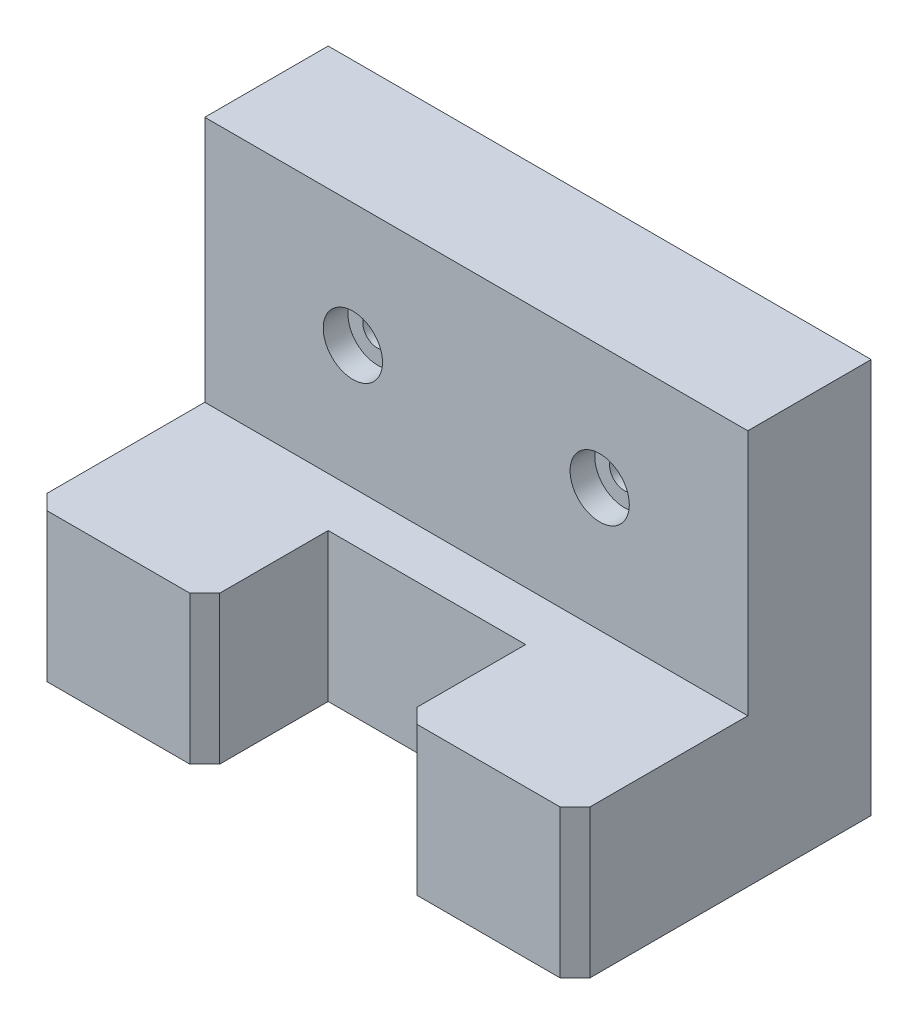
ISO-10303-21;
HEADER;
FILE_DESCRIPTION(('STEP AP214'),'2;1');
FILE_NAME('part.step','',(''),(''),'','','');
FILE_SCHEMA(('AUTOMOTIVE_DESIGN { 1 0 10303 214 1 1 1 1 }'));
ENDSEC;
DATA;
#1=APPLICATION_CONTEXT('core data for automotive mechanical design processes');
#2=APPLICATION_PROTOCOL_DEFINITION('international standard','automotive_design',2000,#1);
#3=PRODUCT_CONTEXT('',#1,'mechanical');
#4=PRODUCT('Part','Part','',(#3));
#5=PRODUCT_RELATED_PRODUCT_CATEGORY('part','',(#4));
#6=PRODUCT_DEFINITION_FORMATION('','',#4);
#7=PRODUCT_DEFINITION_CONTEXT('part definition',#1,'design');
#8=PRODUCT_DEFINITION('design','',#6,#7);
#9=PRODUCT_DEFINITION_SHAPE('','',#8);
#10=(LENGTH_UNIT() NAMED_UNIT(*) SI_UNIT(.MILLI.,.METRE.));
#11=(NAMED_UNIT(*) PLANE_ANGLE_UNIT() SI_UNIT($,.RADIAN.));
#12=(NAMED_UNIT(*) SI_UNIT($,.STERADIAN.) SOLID_ANGLE_UNIT());
#13=UNCERTAINTY_MEASURE_WITH_UNIT(LENGTH_MEASURE(1.E-05),#10,'distance_accuracy_value','');
#14=(GEOMETRIC_REPRESENTATION_CONTEXT(3) GLOBAL_UNCERTAINTY_ASSIGNED_CONTEXT((#13)) GLOBAL_UNIT_ASSIGNED_CONTEXT((#10,
#11,#12)) REPRESENTATION_CONTEXT('',''));
#15=CARTESIAN_POINT('',(0.,0.,0.));
#16=DIRECTION('',(0.,0.,1.));
#17=DIRECTION('',(1.,0.,0.));
#18=AXIS2_PLACEMENT_3D('',#15,#16,#17);
#19=CARTESIAN_POINT('',(25.,55.,-36.8755908022283));
#20=DIRECTION('',(0.,0.,1.));
#21=DIRECTION('',(1.,0.,0.));
#22=AXIS2_PLACEMENT_3D('',#19,#20,#21);
#23=CYLINDRICAL_SURFACE('',#22,3.);
#24=CARTESIAN_POINT('',(25.,55.,-36.8755908022283));
#25=DIRECTION('',(0.,0.,1.));
#26=DIRECTION('',(1.,0.,0.));
#27=AXIS2_PLACEMENT_3D('',#24,#25,#26);
#28=CIRCLE('',#27,3.);
#29=CARTESIAN_POINT('',(28.,55.,-36.8755908022283));
#30=VERTEX_POINT('',#29);
#31=EDGE_CURVE('E231',#30,#30,#28,.T.);
#32=ORIENTED_EDGE('',*,*,#31,.F.);
#33=EDGE_LOOP('',(#32));
#34=FACE_BOUND('',#33,.T.);
#35=CARTESIAN_POINT('',(25.,55.,-16.8755908022283));
#36=DIRECTION('',(0.,0.,1.));
#37=DIRECTION('',(1.,0.,0.));
#38=AXIS2_PLACEMENT_3D('',#35,#36,#37);
#39=CIRCLE('',#38,3.);
#40=CARTESIAN_POINT('',(28.,55.,-16.8755908022283));
#41=VERTEX_POINT('',#40);
#42=EDGE_CURVE('E227',#41,#41,#39,.F.);
#43=ORIENTED_EDGE('',*,*,#42,.F.);
#44=EDGE_LOOP('',(#43));
#45=FACE_BOUND('',#44,.T.);
#46=ADVANCED_FACE('F45',(#34,#45),#23,.F.);
#47=CARTESIAN_POINT('',(-25.,55.,-36.8755908022283));
#48=DIRECTION('',(0.,0.,1.));
#49=DIRECTION('',(1.,0.,0.));
#50=AXIS2_PLACEMENT_3D('',#47,#48,#49);
#51=CYLINDRICAL_SURFACE('',#50,3.);
#52=CARTESIAN_POINT('',(-25.,55.,-36.8755908022283));
#53=DIRECTION('',(0.,0.,1.));
#54=DIRECTION('',(1.,0.,0.));
#55=AXIS2_PLACEMENT_3D('',#52,#53,#54);
#56=CIRCLE('',#55,3.);
#57=CARTESIAN_POINT('',(-22.,55.,-36.8755908022283));
#58=VERTEX_POINT('',#57);
#59=EDGE_CURVE('E178',#58,#58,#56,.T.);
#60=ORIENTED_EDGE('',*,*,#59,.F.);
#61=EDGE_LOOP('',(#60));
#62=FACE_BOUND('',#61,.T.);
#63=CARTESIAN_POINT('',(-25.,55.,-16.8755908022283));
#64=DIRECTION('',(0.,0.,1.));
#65=DIRECTION('',(1.,0.,0.));
#66=AXIS2_PLACEMENT_3D('',#63,#64,#65);
#67=CIRCLE('',#66,3.);
#68=CARTESIAN_POINT('',(-22.,55.,-16.8755908022283));
#69=VERTEX_POINT('',#68);
#70=EDGE_CURVE('E224',#69,#69,#67,.F.);
#71=ORIENTED_EDGE('',*,*,#70,.F.);
#72=EDGE_LOOP('',(#71));
#73=FACE_BOUND('',#72,.T.);
#74=ADVANCED_FACE('F315',(#62,#73),#51,.F.);
#75=CARTESIAN_POINT('',(55.,30.,23.1244091977717));
#76=DIRECTION('',(0.,0.,-1.));
#77=DIRECTION('',(-1.,0.,0.));
#78=AXIS2_PLACEMENT_3D('',#75,#76,#77);
#79=PLANE('',#78);
#80=DIRECTION('',(-1.,0.,0.));
#81=VECTOR('',#80,1.);
#82=CARTESIAN_POINT('',(55.,0.,23.1244091977717));
#83=LINE('',#82,#81);
#84=CARTESIAN_POINT('',(-23.,0.,23.1244091977717));
#85=VERTEX_POINT('',#84);
#86=CARTESIAN_POINT('',(-52.,0.,23.1244091977717));
#87=VERTEX_POINT('',#86);
#88=EDGE_CURVE('E220',#85,#87,#83,.T.);
#89=ORIENTED_EDGE('',*,*,#88,.F.);
#90=DIRECTION('',(0.,1.,0.));
#91=VECTOR('',#90,1.);
#92=CARTESIAN_POINT('',(-23.,30.,23.1244091977717));
#93=LINE('',#92,#91);
#94=CARTESIAN_POINT('',(-23.,30.,23.1244091977717));
#95=VERTEX_POINT('',#94);
#96=EDGE_CURVE('E257',#85,#95,#93,.T.);
#97=ORIENTED_EDGE('',*,*,#96,.T.);
#98=DIRECTION('',(-1.,0.,0.));
#99=VECTOR('',#98,1.);
#100=CARTESIAN_POINT('',(55.,30.,23.1244091977717));
#101=LINE('',#100,#99);
#102=CARTESIAN_POINT('',(-52.,30.,23.1244091977717));
#103=VERTEX_POINT('',#102);
#104=EDGE_CURVE('E196',#95,#103,#101,.T.);
#105=ORIENTED_EDGE('',*,*,#104,.T.);
#106=DIRECTION('',(0.,-1.,0.));
#107=VECTOR('',#106,1.);
#108=CARTESIAN_POINT('',(-52.,30.,23.1244091977717));
#109=LINE('',#108,#107);
#110=EDGE_CURVE('E254',#103,#87,#109,.T.);
#111=ORIENTED_EDGE('',*,*,#110,.T.);
#112=EDGE_LOOP('',(#89,#97,#105,#111));
#113=FACE_BOUND('',#112,.T.);
#114=ADVANCED_FACE('F271',(#113),#79,.F.);
#115=CARTESIAN_POINT('',(52.,0.,23.1244091977717));
#116=VERTEX_POINT('',#115);
#117=CARTESIAN_POINT('',(23.,0.,23.1244091977717));
#118=VERTEX_POINT('',#117);
#119=EDGE_CURVE('E221',#116,#118,#83,.T.);
#120=ORIENTED_EDGE('',*,*,#119,.F.);
#121=DIRECTION('',(0.,1.,0.));
#122=VECTOR('',#121,1.);
#123=CARTESIAN_POINT('',(52.,30.,23.1244091977717));
#124=LINE('',#123,#122);
#125=CARTESIAN_POINT('',(52.,30.,23.1244091977717));
#126=VERTEX_POINT('',#125);
#127=EDGE_CURVE('E243',#116,#126,#124,.T.);
#128=ORIENTED_EDGE('',*,*,#127,.T.);
#129=CARTESIAN_POINT('',(23.,30.,23.1244091977717));
#130=VERTEX_POINT('',#129);
#131=EDGE_CURVE('E207',#126,#130,#101,.T.);
#132=ORIENTED_EDGE('',*,*,#131,.T.);
#133=DIRECTION('',(0.,-1.,0.));
#134=VECTOR('',#133,1.);
#135=CARTESIAN_POINT('',(23.,30.,23.1244091977717));
#136=LINE('',#135,#134);
#137=EDGE_CURVE('E241',#130,#118,#136,.T.);
#138=ORIENTED_EDGE('',*,*,#137,.T.);
#139=EDGE_LOOP('',(#120,#128,#132,#138));
#140=FACE_BOUND('',#139,.T.);
#141=ADVANCED_FACE('F300',(#140),#79,.F.);
#142=CARTESIAN_POINT('',(55.,0.,23.1244091977717));
#143=DIRECTION('',(0.,1.,0.));
#144=DIRECTION('',(0.,0.,1.));
#145=AXIS2_PLACEMENT_3D('',#142,#143,#144);
#146=PLANE('',#145);
#147=DIRECTION('',(0.,0.,-1.));
#148=VECTOR('',#147,1.);
#149=CARTESIAN_POINT('',(55.,0.,23.1244091977717));
#150=LINE('',#149,#148);
#151=CARTESIAN_POINT('',(55.,0.,20.1244091977718));
#152=VERTEX_POINT('',#151);
#153=CARTESIAN_POINT('',(55.,0.,-36.8755908022283));
#154=VERTEX_POINT('',#153);
#155=EDGE_CURVE('E184',#152,#154,#150,.T.);
#156=ORIENTED_EDGE('',*,*,#155,.F.);
#157=DIRECTION('',(-0.707106781186549,0.,0.707106781186546));
#158=VECTOR('',#157,1.);
#159=CARTESIAN_POINT('',(55.,0.,20.1244091977718));
#160=LINE('',#159,#158);
#161=EDGE_CURVE('E239',#152,#116,#160,.T.);
#162=ORIENTED_EDGE('',*,*,#161,.T.);
#163=ORIENTED_EDGE('',*,*,#119,.T.);
#164=DIRECTION('',(0.707106781186548,0.,0.707106781186548));
#165=VECTOR('',#164,1.);
#166=CARTESIAN_POINT('',(20.,0.,20.1244091977717));
#167=LINE('',#166,#165);
#168=CARTESIAN_POINT('',(20.,0.,20.1244091977717));
#169=VERTEX_POINT('',#168);
#170=EDGE_CURVE('E156',#118,#169,#167,.F.);
#171=ORIENTED_EDGE('',*,*,#170,.T.);
#172=DIRECTION('',(0.,0.,-1.));
#173=VECTOR('',#172,1.);
#174=CARTESIAN_POINT('',(20.,0.,23.1244091977717));
#175=LINE('',#174,#173);
#176=CARTESIAN_POINT('',(20.,0.,-1.87559080222826));
#177=VERTEX_POINT('',#176);
#178=EDGE_CURVE('E147',#169,#177,#175,.T.);
#179=ORIENTED_EDGE('',*,*,#178,.T.);
#180=DIRECTION('',(-1.,0.,0.));
#181=VECTOR('',#180,1.);
#182=CARTESIAN_POINT('',(-20.,0.,-1.87559080222826));
#183=LINE('',#182,#181);
#184=CARTESIAN_POINT('',(-20.,0.,-1.87559080222826));
#185=VERTEX_POINT('',#184);
#186=EDGE_CURVE('E153',#177,#185,#183,.T.);
#187=ORIENTED_EDGE('',*,*,#186,.T.);
#188=DIRECTION('',(0.,0.,1.));
#189=VECTOR('',#188,1.);
#190=CARTESIAN_POINT('',(-20.,0.,23.1244091977717));
#191=LINE('',#190,#189);
#192=CARTESIAN_POINT('',(-20.,0.,20.1244091977717));
#193=VERTEX_POINT('',#192);
#194=EDGE_CURVE('E158',#185,#193,#191,.T.);
#195=ORIENTED_EDGE('',*,*,#194,.T.);
#196=DIRECTION('',(0.707106781186546,0.,-0.707106781186549));
#197=VECTOR('',#196,1.);
#198=CARTESIAN_POINT('',(-23.,0.,23.1244091977717));
#199=LINE('',#198,#197);
#200=EDGE_CURVE('E236',#193,#85,#199,.F.);
#201=ORIENTED_EDGE('',*,*,#200,.T.);
#202=ORIENTED_EDGE('',*,*,#88,.T.);
#203=DIRECTION('',(0.707106781186546,0.,0.707106781186549));
#204=VECTOR('',#203,1.);
#205=CARTESIAN_POINT('',(-52.,0.,23.1244091977717));
#206=LINE('',#205,#204);
#207=CARTESIAN_POINT('',(-55.,0.,20.1244091977717));
#208=VERTEX_POINT('',#207);
#209=EDGE_CURVE('E234',#87,#208,#206,.F.);
#210=ORIENTED_EDGE('',*,*,#209,.T.);
#211=DIRECTION('',(0.,0.,-1.));
#212=VECTOR('',#211,1.);
#213=CARTESIAN_POINT('',(-55.,0.,23.1244091977717));
#214=LINE('',#213,#212);
#215=CARTESIAN_POINT('',(-55.,0.,-36.8755908022283));
#216=VERTEX_POINT('',#215);
#217=EDGE_CURVE('E182',#208,#216,#214,.T.);
#218=ORIENTED_EDGE('',*,*,#217,.T.);
#219=DIRECTION('',(-1.,0.,0.));
#220=VECTOR('',#219,1.);
#221=CARTESIAN_POINT('',(55.,0.,-36.8755908022283));
#222=LINE('',#221,#220);
#223=EDGE_CURVE('E217',#154,#216,#222,.T.);
#224=ORIENTED_EDGE('',*,*,#223,.F.);
#225=EDGE_LOOP('',(#156,#162,#163,#171,#179,#187,#195,#201,#202,#210,#218,#224));
#226=FACE_BOUND('',#225,.T.);
#227=ADVANCED_FACE('F150',(#226),#146,.F.);
#228=CARTESIAN_POINT('',(55.,0.,-36.8755908022283));
#229=DIRECTION('',(0.,0.,1.));
#230=DIRECTION('',(1.,0.,0.));
#231=AXIS2_PLACEMENT_3D('',#228,#229,#230);
#232=PLANE('',#231);
#233=ORIENTED_EDGE('',*,*,#59,.T.);
#234=EDGE_LOOP('',(#233));
#235=FACE_BOUND('',#234,.T.);
#236=ORIENTED_EDGE('',*,*,#31,.T.);
#237=EDGE_LOOP('',(#236));
#238=FACE_BOUND('',#237,.T.);
#239=DIRECTION('',(0.,1.,0.));
#240=VECTOR('',#239,1.);
#241=CARTESIAN_POINT('',(-55.,0.,-36.8755908022283));
#242=LINE('',#241,#240);
#243=CARTESIAN_POINT('',(-55.,80.,-36.8755908022283));
#244=VERTEX_POINT('',#243);
#245=EDGE_CURVE('E198',#216,#244,#242,.T.);
#246=ORIENTED_EDGE('',*,*,#245,.T.);
#247=DIRECTION('',(-1.,0.,0.));
#248=VECTOR('',#247,1.);
#249=CARTESIAN_POINT('',(55.,80.,-36.8755908022283));
#250=LINE('',#249,#248);
#251=CARTESIAN_POINT('',(55.,80.,-36.8755908022283));
#252=VERTEX_POINT('',#251);
#253=EDGE_CURVE('E214',#252,#244,#250,.T.);
#254=ORIENTED_EDGE('',*,*,#253,.F.);
#255=DIRECTION('',(0.,1.,0.));
#256=VECTOR('',#255,1.);
#257=CARTESIAN_POINT('',(55.,0.,-36.8755908022283));
#258=LINE('',#257,#256);
#259=EDGE_CURVE('E186',#154,#252,#258,.T.);
#260=ORIENTED_EDGE('',*,*,#259,.F.);
#261=ORIENTED_EDGE('',*,*,#223,.T.);
#262=EDGE_LOOP('',(#246,#254,#260,#261));
#263=FACE_BOUND('',#262,.T.);
#264=ADVANCED_FACE('F285',(#235,#238,#263),#232,.F.);
#265=CARTESIAN_POINT('',(55.,80.,-36.8755908022283));
#266=DIRECTION('',(0.,-1.,0.));
#267=DIRECTION('',(0.,0.,-1.));
#268=AXIS2_PLACEMENT_3D('',#265,#266,#267);
#269=PLANE('',#268);
#270=DIRECTION('',(0.,0.,1.));
#271=VECTOR('',#270,1.);
#272=CARTESIAN_POINT('',(-55.,80.,-36.8755908022283));
#273=LINE('',#272,#271);
#274=CARTESIAN_POINT('',(-55.,80.,-11.8755908022283));
#275=VERTEX_POINT('',#274);
#276=EDGE_CURVE('E200',#244,#275,#273,.T.);
#277=ORIENTED_EDGE('',*,*,#276,.T.);
#278=DIRECTION('',(-1.,0.,0.));
#279=VECTOR('',#278,1.);
#280=CARTESIAN_POINT('',(55.,80.,-11.8755908022283));
#281=LINE('',#280,#279);
#282=CARTESIAN_POINT('',(55.,80.,-11.8755908022283));
#283=VERTEX_POINT('',#282);
#284=EDGE_CURVE('E211',#283,#275,#281,.T.);
#285=ORIENTED_EDGE('',*,*,#284,.F.);
#286=DIRECTION('',(0.,0.,1.));
#287=VECTOR('',#286,1.);
#288=CARTESIAN_POINT('',(55.,80.,-36.8755908022283));
#289=LINE('',#288,#287);
#290=EDGE_CURVE('E189',#252,#283,#289,.T.);
#291=ORIENTED_EDGE('',*,*,#290,.F.);
#292=ORIENTED_EDGE('',*,*,#253,.T.);
#293=EDGE_LOOP('',(#277,#285,#291,#292));
#294=FACE_BOUND('',#293,.T.);
#295=ADVANCED_FACE('F289',(#294),#269,.F.);
#296=CARTESIAN_POINT('',(55.,80.,-11.8755908022283));
#297=DIRECTION('',(0.,0.,-1.));
#298=DIRECTION('',(0.,1.,0.));
#299=AXIS2_PLACEMENT_3D('',#296,#297,#298);
#300=PLANE('',#299);
#301=CARTESIAN_POINT('',(-25.,55.,-11.8755908022283));
#302=DIRECTION('',(0.,0.,1.));
#303=DIRECTION('',(1.,0.,0.));
#304=AXIS2_PLACEMENT_3D('',#301,#302,#303);
#305=CIRCLE('',#304,6.);
#306=CARTESIAN_POINT('',(-19.,55.,-11.8755908022283));
#307=VERTEX_POINT('',#306);
#308=EDGE_CURVE('E502',#307,#307,#305,.T.);
#309=ORIENTED_EDGE('',*,*,#308,.F.);
#310=EDGE_LOOP('',(#309));
#311=FACE_BOUND('',#310,.T.);
#312=CARTESIAN_POINT('',(25.,55.,-11.8755908022283));
#313=DIRECTION('',(0.,0.,1.));
#314=DIRECTION('',(1.,0.,0.));
#315=AXIS2_PLACEMENT_3D('',#312,#313,#314);
#316=CIRCLE('',#315,6.);
#317=CARTESIAN_POINT('',(31.,55.,-11.8755908022283));
#318=VERTEX_POINT('',#317);
#319=EDGE_CURVE('E499',#318,#318,#316,.T.);
#320=ORIENTED_EDGE('',*,*,#319,.F.);
#321=EDGE_LOOP('',(#320));
#322=FACE_BOUND('',#321,.T.);
#323=DIRECTION('',(0.,-1.,0.));
#324=VECTOR('',#323,1.);
#325=CARTESIAN_POINT('',(-55.,80.,-11.8755908022283));
#326=LINE('',#325,#324);
#327=CARTESIAN_POINT('',(-55.,30.,-11.8755908022283));
#328=VERTEX_POINT('',#327);
#329=EDGE_CURVE('E202',#275,#328,#326,.T.);
#330=ORIENTED_EDGE('',*,*,#329,.T.);
#331=DIRECTION('',(-1.,0.,0.));
#332=VECTOR('',#331,1.);
#333=CARTESIAN_POINT('',(55.,30.,-11.8755908022283));
#334=LINE('',#333,#332);
#335=CARTESIAN_POINT('',(55.,30.,-11.8755908022283));
#336=VERTEX_POINT('',#335);
#337=EDGE_CURVE('E208',#336,#328,#334,.T.);
#338=ORIENTED_EDGE('',*,*,#337,.F.);
#339=DIRECTION('',(0.,-1.,0.));
#340=VECTOR('',#339,1.);
#341=CARTESIAN_POINT('',(55.,80.,-11.8755908022283));
#342=LINE('',#341,#340);
#343=EDGE_CURVE('E191',#283,#336,#342,.T.);
#344=ORIENTED_EDGE('',*,*,#343,.F.);
#345=ORIENTED_EDGE('',*,*,#284,.T.);
#346=EDGE_LOOP('',(#330,#338,#344,#345));
#347=FACE_BOUND('',#346,.T.);
#348=ADVANCED_FACE('F340',(#311,#322,#347),#300,.F.);
#349=CARTESIAN_POINT('',(55.,30.,-11.8755908022283));
#350=DIRECTION('',(0.,-1.,0.));
#351=DIRECTION('',(0.,0.,-1.));
#352=AXIS2_PLACEMENT_3D('',#349,#350,#351);
#353=PLANE('',#352);
#354=ORIENTED_EDGE('',*,*,#131,.F.);
#355=DIRECTION('',(0.707106781186549,0.,-0.707106781186546));
#356=VECTOR('',#355,1.);
#357=CARTESIAN_POINT('',(55.,30.,20.1244091977718));
#358=LINE('',#357,#356);
#359=CARTESIAN_POINT('',(55.,30.,20.1244091977718));
#360=VERTEX_POINT('',#359);
#361=EDGE_CURVE('E250',#126,#360,#358,.T.);
#362=ORIENTED_EDGE('',*,*,#361,.T.);
#363=DIRECTION('',(0.,0.,1.));
#364=VECTOR('',#363,1.);
#365=CARTESIAN_POINT('',(55.,30.,-11.8755908022283));
#366=LINE('',#365,#364);
#367=EDGE_CURVE('E193',#336,#360,#366,.T.);
#368=ORIENTED_EDGE('',*,*,#367,.F.);
#369=ORIENTED_EDGE('',*,*,#337,.T.);
#370=DIRECTION('',(0.,0.,1.));
#371=VECTOR('',#370,1.);
#372=CARTESIAN_POINT('',(-55.,30.,-11.8755908022283));
#373=LINE('',#372,#371);
#374=CARTESIAN_POINT('',(-55.,30.,20.1244091977717));
#375=VERTEX_POINT('',#374);
#376=EDGE_CURVE('E187',#328,#375,#373,.T.);
#377=ORIENTED_EDGE('',*,*,#376,.T.);
#378=DIRECTION('',(-0.707106781186546,0.,-0.707106781186549));
#379=VECTOR('',#378,1.);
#380=CARTESIAN_POINT('',(-52.,30.,23.1244091977717));
#381=LINE('',#380,#379);
#382=EDGE_CURVE('E245',#375,#103,#381,.F.);
#383=ORIENTED_EDGE('',*,*,#382,.T.);
#384=ORIENTED_EDGE('',*,*,#104,.F.);
#385=DIRECTION('',(-0.707106781186546,0.,0.707106781186549));
#386=VECTOR('',#385,1.);
#387=CARTESIAN_POINT('',(-23.,30.,23.1244091977717));
#388=LINE('',#387,#386);
#389=CARTESIAN_POINT('',(-20.,30.,20.1244091977717));
#390=VERTEX_POINT('',#389);
#391=EDGE_CURVE('E247',#95,#390,#388,.F.);
#392=ORIENTED_EDGE('',*,*,#391,.T.);
#393=DIRECTION('',(0.,0.,1.));
#394=VECTOR('',#393,1.);
#395=CARTESIAN_POINT('',(-20.,30.,23.1244091977717));
#396=LINE('',#395,#394);
#397=CARTESIAN_POINT('',(-20.,30.,-1.87559080222826));
#398=VERTEX_POINT('',#397);
#399=EDGE_CURVE('E175',#398,#390,#396,.T.);
#400=ORIENTED_EDGE('',*,*,#399,.F.);
#401=DIRECTION('',(-1.,0.,0.));
#402=VECTOR('',#401,1.);
#403=CARTESIAN_POINT('',(-20.,30.,-1.87559080222826));
#404=LINE('',#403,#402);
#405=CARTESIAN_POINT('',(20.,30.,-1.87559080222826));
#406=VERTEX_POINT('',#405);
#407=EDGE_CURVE('E180',#406,#398,#404,.T.);
#408=ORIENTED_EDGE('',*,*,#407,.F.);
#409=DIRECTION('',(0.,0.,-1.));
#410=VECTOR('',#409,1.);
#411=CARTESIAN_POINT('',(20.,30.,23.1244091977717));
#412=LINE('',#411,#410);
#413=CARTESIAN_POINT('',(20.,30.,20.1244091977717));
#414=VERTEX_POINT('',#413);
#415=EDGE_CURVE('E164',#414,#406,#412,.T.);
#416=ORIENTED_EDGE('',*,*,#415,.F.);
#417=DIRECTION('',(-0.707106781186548,0.,-0.707106781186548));
#418=VECTOR('',#417,1.);
#419=CARTESIAN_POINT('',(20.,30.,20.1244091977717));
#420=LINE('',#419,#418);
#421=EDGE_CURVE('E66',#414,#130,#420,.F.);
#422=ORIENTED_EDGE('',*,*,#421,.T.);
#423=EDGE_LOOP('',(#354,#362,#368,#369,#377,#383,#384,#392,#400,#408,#416,#422));
#424=FACE_BOUND('',#423,.T.);
#425=ADVANCED_FACE('F275',(#424),#353,.F.);
#426=CARTESIAN_POINT('',(55.,0.,0.));
#427=DIRECTION('',(1.,0.,0.));
#428=DIRECTION('',(0.,0.,-1.));
#429=AXIS2_PLACEMENT_3D('',#426,#427,#428);
#430=PLANE('',#429);
#431=ORIENTED_EDGE('',*,*,#367,.T.);
#432=DIRECTION('',(0.,-1.,0.));
#433=VECTOR('',#432,1.);
#434=CARTESIAN_POINT('',(55.,0.,20.1244091977718));
#435=LINE('',#434,#433);
#436=EDGE_CURVE('E223',#360,#152,#435,.T.);
#437=ORIENTED_EDGE('',*,*,#436,.T.);
#438=ORIENTED_EDGE('',*,*,#155,.T.);
#439=ORIENTED_EDGE('',*,*,#259,.T.);
#440=ORIENTED_EDGE('',*,*,#290,.T.);
#441=ORIENTED_EDGE('',*,*,#343,.T.);
#442=EDGE_LOOP('',(#431,#437,#438,#439,#440,#441));
#443=FACE_BOUND('',#442,.T.);
#444=ADVANCED_FACE('F293',(#443),#430,.T.);
#445=CARTESIAN_POINT('',(-55.,0.,0.));
#446=DIRECTION('',(1.,0.,0.));
#447=DIRECTION('',(0.,0.,-1.));
#448=AXIS2_PLACEMENT_3D('',#445,#446,#447);
#449=PLANE('',#448);
#450=ORIENTED_EDGE('',*,*,#217,.F.);
#451=DIRECTION('',(0.,1.,0.));
#452=VECTOR('',#451,1.);
#453=CARTESIAN_POINT('',(-55.,0.,20.1244091977717));
#454=LINE('',#453,#452);
#455=EDGE_CURVE('E13',#208,#375,#454,.T.);
#456=ORIENTED_EDGE('',*,*,#455,.T.);
#457=ORIENTED_EDGE('',*,*,#376,.F.);
#458=ORIENTED_EDGE('',*,*,#329,.F.);
#459=ORIENTED_EDGE('',*,*,#276,.F.);
#460=ORIENTED_EDGE('',*,*,#245,.F.);
#461=EDGE_LOOP('',(#450,#456,#457,#458,#459,#460));
#462=FACE_BOUND('',#461,.T.);
#463=ADVANCED_FACE('F280',(#462),#449,.F.);
#464=CARTESIAN_POINT('',(-20.,0.,23.1244091977717));
#465=DIRECTION('',(-1.,0.,0.));
#466=DIRECTION('',(0.,0.,1.));
#467=AXIS2_PLACEMENT_3D('',#464,#465,#466);
#468=PLANE('',#467);
#469=ORIENTED_EDGE('',*,*,#399,.T.);
#470=DIRECTION('',(0.,-1.,0.));
#471=VECTOR('',#470,1.);
#472=CARTESIAN_POINT('',(-20.,0.,20.1244091977717));
#473=LINE('',#472,#471);
#474=EDGE_CURVE('E53',#390,#193,#473,.T.);
#475=ORIENTED_EDGE('',*,*,#474,.T.);
#476=ORIENTED_EDGE('',*,*,#194,.F.);
#477=DIRECTION('',(0.,1.,0.));
#478=VECTOR('',#477,1.);
#479=CARTESIAN_POINT('',(-20.,0.,-1.87559080222826));
#480=LINE('',#479,#478);
#481=EDGE_CURVE('E168',#185,#398,#480,.T.);
#482=ORIENTED_EDGE('',*,*,#481,.T.);
#483=EDGE_LOOP('',(#469,#475,#476,#482));
#484=FACE_BOUND('',#483,.T.);
#485=ADVANCED_FACE('F261',(#484),#468,.F.);
#486=CARTESIAN_POINT('',(-20.,0.,-1.87559080222826));
#487=DIRECTION('',(0.,0.,-1.));
#488=DIRECTION('',(0.,1.,0.));
#489=AXIS2_PLACEMENT_3D('',#486,#487,#488);
#490=PLANE('',#489);
#491=ORIENTED_EDGE('',*,*,#407,.T.);
#492=ORIENTED_EDGE('',*,*,#481,.F.);
#493=ORIENTED_EDGE('',*,*,#186,.F.);
#494=DIRECTION('',(0.,1.,0.));
#495=VECTOR('',#494,1.);
#496=CARTESIAN_POINT('',(20.,0.,-1.87559080222826));
#497=LINE('',#496,#495);
#498=EDGE_CURVE('E161',#177,#406,#497,.T.);
#499=ORIENTED_EDGE('',*,*,#498,.T.);
#500=EDGE_LOOP('',(#491,#492,#493,#499));
#501=FACE_BOUND('',#500,.T.);
#502=ADVANCED_FACE('F170',(#501),#490,.F.);
#503=CARTESIAN_POINT('',(20.,0.,23.1244091977717));
#504=DIRECTION('',(1.,0.,0.));
#505=DIRECTION('',(0.,0.,-1.));
#506=AXIS2_PLACEMENT_3D('',#503,#504,#505);
#507=PLANE('',#506);
#508=ORIENTED_EDGE('',*,*,#178,.F.);
#509=DIRECTION('',(0.,1.,0.));
#510=VECTOR('',#509,1.);
#511=CARTESIAN_POINT('',(20.,0.,20.1244091977717));
#512=LINE('',#511,#510);
#513=EDGE_CURVE('E252',#169,#414,#512,.T.);
#514=ORIENTED_EDGE('',*,*,#513,.T.);
#515=ORIENTED_EDGE('',*,*,#415,.T.);
#516=ORIENTED_EDGE('',*,*,#498,.F.);
#517=EDGE_LOOP('',(#508,#514,#515,#516));
#518=FACE_BOUND('',#517,.T.);
#519=ADVANCED_FACE('F162',(#518),#507,.F.);
#520=CARTESIAN_POINT('',(-25.,55.,-16.8755908022283));
#521=DIRECTION('',(0.,0.,1.));
#522=DIRECTION('',(1.,0.,0.));
#523=AXIS2_PLACEMENT_3D('',#520,#521,#522);
#524=PLANE('',#523);
#525=CARTESIAN_POINT('',(-25.,55.,-16.8755908022283));
#526=DIRECTION('',(0.,0.,1.));
#527=DIRECTION('',(1.,0.,0.));
#528=AXIS2_PLACEMENT_3D('',#525,#526,#527);
#529=CIRCLE('',#528,6.);
#530=CARTESIAN_POINT('',(-19.,55.,-16.8755908022283));
#531=VERTEX_POINT('',#530);
#532=EDGE_CURVE('E228',#531,#531,#529,.T.);
#533=ORIENTED_EDGE('',*,*,#532,.T.);
#534=EDGE_LOOP('',(#533));
#535=FACE_BOUND('',#534,.T.);
#536=ORIENTED_EDGE('',*,*,#70,.T.);
#537=EDGE_LOOP('',(#536));
#538=FACE_BOUND('',#537,.T.);
#539=ADVANCED_FACE('F331',(#535,#538),#524,.T.);
#540=CARTESIAN_POINT('',(-25.,55.,-16.8755908022283));
#541=DIRECTION('',(0.,0.,1.));
#542=DIRECTION('',(1.,0.,0.));
#543=AXIS2_PLACEMENT_3D('',#540,#541,#542);
#544=CYLINDRICAL_SURFACE('',#543,6.);
#545=ORIENTED_EDGE('',*,*,#532,.F.);
#546=EDGE_LOOP('',(#545));
#547=FACE_BOUND('',#546,.T.);
#548=ORIENTED_EDGE('',*,*,#308,.T.);
#549=EDGE_LOOP('',(#548));
#550=FACE_BOUND('',#549,.T.);
#551=ADVANCED_FACE('F383',(#547,#550),#544,.F.);
#552=CARTESIAN_POINT('',(25.,55.,-16.8755908022283));
#553=DIRECTION('',(0.,0.,1.));
#554=DIRECTION('',(1.,0.,0.));
#555=AXIS2_PLACEMENT_3D('',#552,#553,#554);
#556=PLANE('',#555);
#557=CARTESIAN_POINT('',(25.,55.,-16.8755908022283));
#558=DIRECTION('',(0.,0.,1.));
#559=DIRECTION('',(1.,0.,0.));
#560=AXIS2_PLACEMENT_3D('',#557,#558,#559);
#561=CIRCLE('',#560,6.);
#562=CARTESIAN_POINT('',(31.,55.,-16.8755908022283));
#563=VERTEX_POINT('',#562);
#564=EDGE_CURVE('E496',#563,#563,#561,.T.);
#565=ORIENTED_EDGE('',*,*,#564,.T.);
#566=EDGE_LOOP('',(#565));
#567=FACE_BOUND('',#566,.T.);
#568=ORIENTED_EDGE('',*,*,#42,.T.);
#569=EDGE_LOOP('',(#568));
#570=FACE_BOUND('',#569,.T.);
#571=ADVANCED_FACE('F393',(#567,#570),#556,.T.);
#572=CARTESIAN_POINT('',(25.,55.,-16.8755908022283));
#573=DIRECTION('',(0.,0.,1.));
#574=DIRECTION('',(1.,0.,0.));
#575=AXIS2_PLACEMENT_3D('',#572,#573,#574);
#576=CYLINDRICAL_SURFACE('',#575,6.);
#577=ORIENTED_EDGE('',*,*,#564,.F.);
#578=EDGE_LOOP('',(#577));
#579=FACE_BOUND('',#578,.T.);
#580=ORIENTED_EDGE('',*,*,#319,.T.);
#581=EDGE_LOOP('',(#580));
#582=FACE_BOUND('',#581,.T.);
#583=ADVANCED_FACE('F312',(#579,#582),#576,.F.);
#584=CARTESIAN_POINT('',(55.,0.,20.1244091977718));
#585=DIRECTION('',(0.707106781186546,0.,0.707106781186549));
#586=DIRECTION('',(0.,1.,0.));
#587=AXIS2_PLACEMENT_3D('',#584,#585,#586);
#588=PLANE('',#587);
#589=ORIENTED_EDGE('',*,*,#361,.F.);
#590=ORIENTED_EDGE('',*,*,#127,.F.);
#591=ORIENTED_EDGE('',*,*,#161,.F.);
#592=ORIENTED_EDGE('',*,*,#436,.F.);
#593=EDGE_LOOP('',(#589,#590,#591,#592));
#594=FACE_BOUND('',#593,.T.);
#595=ADVANCED_FACE('F303',(#594),#588,.T.);
#596=CARTESIAN_POINT('',(20.,0.,20.1244091977717));
#597=DIRECTION('',(0.707106781186547,0.,-0.707106781186547));
#598=DIRECTION('',(0.,1.,0.));
#599=AXIS2_PLACEMENT_3D('',#596,#597,#598);
#600=PLANE('',#599);
#601=ORIENTED_EDGE('',*,*,#170,.F.);
#602=ORIENTED_EDGE('',*,*,#137,.F.);
#603=ORIENTED_EDGE('',*,*,#421,.F.);
#604=ORIENTED_EDGE('',*,*,#513,.F.);
#605=EDGE_LOOP('',(#601,#602,#603,#604));
#606=FACE_BOUND('',#605,.T.);
#607=ADVANCED_FACE('F305',(#606),#600,.F.);
#608=CARTESIAN_POINT('',(-23.,30.,23.1244091977717));
#609=DIRECTION('',(-0.707106781186549,0.,-0.707106781186546));
#610=DIRECTION('',(0.,1.,0.));
#611=AXIS2_PLACEMENT_3D('',#608,#609,#610);
#612=PLANE('',#611);
#613=ORIENTED_EDGE('',*,*,#200,.F.);
#614=ORIENTED_EDGE('',*,*,#474,.F.);
#615=ORIENTED_EDGE('',*,*,#391,.F.);
#616=ORIENTED_EDGE('',*,*,#96,.F.);
#617=EDGE_LOOP('',(#613,#614,#615,#616));
#618=FACE_BOUND('',#617,.T.);
#619=ADVANCED_FACE('F268',(#618),#612,.F.);
#620=CARTESIAN_POINT('',(-52.,30.,23.1244091977717));
#621=DIRECTION('',(0.707106781186549,0.,-0.707106781186546));
#622=DIRECTION('',(0.,-1.,0.));
#623=AXIS2_PLACEMENT_3D('',#620,#621,#622);
#624=PLANE('',#623);
#625=ORIENTED_EDGE('',*,*,#382,.F.);
#626=ORIENTED_EDGE('',*,*,#455,.F.);
#627=ORIENTED_EDGE('',*,*,#209,.F.);
#628=ORIENTED_EDGE('',*,*,#110,.F.);
#629=EDGE_LOOP('',(#625,#626,#627,#628));
#630=FACE_BOUND('',#629,.T.);
#631=ADVANCED_FACE('F47',(#630),#624,.F.);
#632=CLOSED_SHELL('',(#46,#74,#114,#141,#227,#264,#295,#348,#425,#444,#463,#485,#502,#519,#539,
#551,#571,#583,#595,#607,#619,#631));
#633=MANIFOLD_SOLID_BREP('B2',#632);
#634=ADVANCED_BREP_SHAPE_REPRESENTATION('',(#18,#633),#14);
#635=SHAPE_DEFINITION_REPRESENTATION(#9,#634);
ENDSEC;
END-ISO-10303-21;
